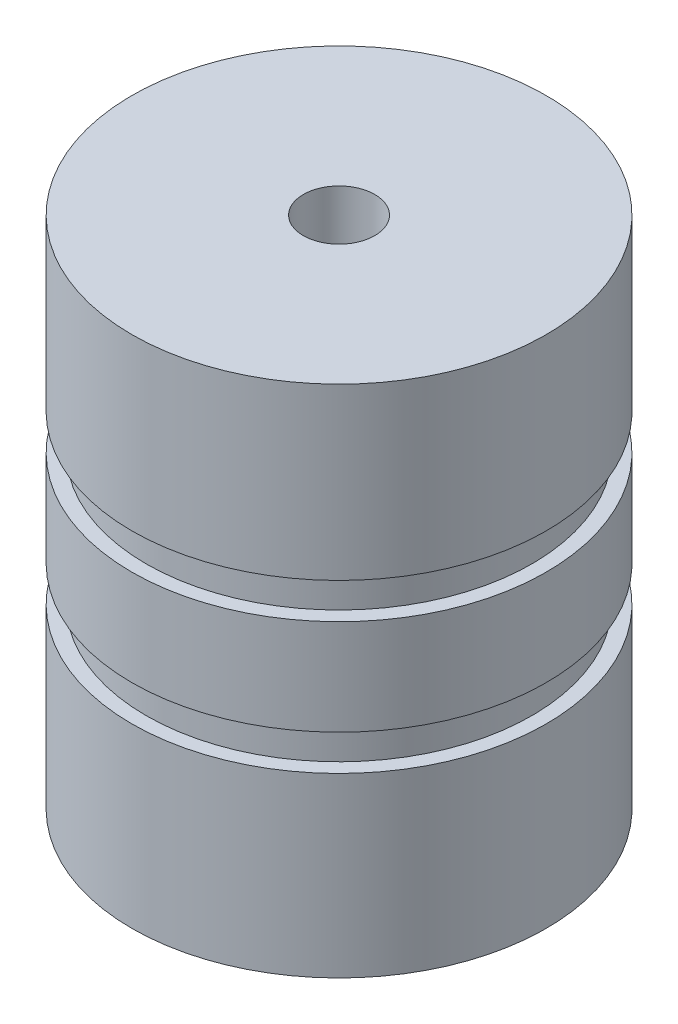
ISO-10303-21;
HEADER;
FILE_DESCRIPTION(('STEP AP214'),'2;1');
FILE_NAME('part.step','',(''),(''),'','','');
FILE_SCHEMA(('AUTOMOTIVE_DESIGN { 1 0 10303 214 1 1 1 1 }'));
ENDSEC;
DATA;
#1=APPLICATION_CONTEXT('core data for automotive mechanical design processes');
#2=APPLICATION_PROTOCOL_DEFINITION('international standard','automotive_design',2000,#1);
#3=PRODUCT_CONTEXT('',#1,'mechanical');
#4=PRODUCT('Part','Part','',(#3));
#5=PRODUCT_RELATED_PRODUCT_CATEGORY('part','',(#4));
#6=PRODUCT_DEFINITION_FORMATION('','',#4);
#7=PRODUCT_DEFINITION_CONTEXT('part definition',#1,'design');
#8=PRODUCT_DEFINITION('design','',#6,#7);
#9=PRODUCT_DEFINITION_SHAPE('','',#8);
#10=(LENGTH_UNIT() NAMED_UNIT(*) SI_UNIT(.MILLI.,.METRE.));
#11=(NAMED_UNIT(*) PLANE_ANGLE_UNIT() SI_UNIT($,.RADIAN.));
#12=(NAMED_UNIT(*) SI_UNIT($,.STERADIAN.) SOLID_ANGLE_UNIT());
#13=UNCERTAINTY_MEASURE_WITH_UNIT(LENGTH_MEASURE(1.E-05),#10,'distance_accuracy_value','');
#14=(GEOMETRIC_REPRESENTATION_CONTEXT(3) GLOBAL_UNCERTAINTY_ASSIGNED_CONTEXT((#13)) GLOBAL_UNIT_ASSIGNED_CONTEXT((#10,
#11,#12)) REPRESENTATION_CONTEXT('',''));
#15=CARTESIAN_POINT('',(0.,0.,0.));
#16=DIRECTION('',(0.,0.,1.));
#17=DIRECTION('',(1.,0.,0.));
#18=AXIS2_PLACEMENT_3D('',#15,#16,#17);
#19=CARTESIAN_POINT('',(0.,18.,0.));
#20=DIRECTION('',(0.,-1.,0.));
#21=DIRECTION('',(0.,0.,-1.));
#22=AXIS2_PLACEMENT_3D('',#19,#20,#21);
#23=CYLINDRICAL_SURFACE('',#22,14.5);
#24=CARTESIAN_POINT('',(0.,-18.,0.));
#25=DIRECTION('',(0.,1.,0.));
#26=DIRECTION('',(0.,0.,1.));
#27=AXIS2_PLACEMENT_3D('',#24,#25,#26);
#28=CIRCLE('',#27,14.5);
#29=CARTESIAN_POINT('',(0.,-18.,14.5));
#30=VERTEX_POINT('',#29);
#31=EDGE_CURVE('E52',#30,#30,#28,.T.);
#32=ORIENTED_EDGE('',*,*,#31,.T.);
#33=EDGE_LOOP('',(#32));
#34=FACE_BOUND('',#33,.T.);
#35=CARTESIAN_POINT('',(0.,-5.6,0.));
#36=DIRECTION('',(0.,1.,0.));
#37=DIRECTION('',(0.,0.,1.));
#38=AXIS2_PLACEMENT_3D('',#35,#36,#37);
#39=CIRCLE('',#38,14.5);
#40=CARTESIAN_POINT('',(0.,-5.60000000000001,14.5));
#41=VERTEX_POINT('',#40);
#42=EDGE_CURVE('E88',#41,#41,#39,.T.);
#43=ORIENTED_EDGE('',*,*,#42,.F.);
#44=EDGE_LOOP('',(#43));
#45=FACE_BOUND('',#44,.T.);
#46=ADVANCED_FACE('F43',(#34,#45),#23,.T.);
#47=CARTESIAN_POINT('',(0.,-18.,0.));
#48=DIRECTION('',(0.,1.,0.));
#49=DIRECTION('',(0.,0.,1.));
#50=AXIS2_PLACEMENT_3D('',#47,#48,#49);
#51=PLANE('',#50);
#52=CARTESIAN_POINT('',(0.,-18.,0.));
#53=DIRECTION('',(0.,1.,0.));
#54=DIRECTION('',(0.,0.,1.));
#55=AXIS2_PLACEMENT_3D('',#52,#53,#54);
#56=CIRCLE('',#55,4.);
#57=CARTESIAN_POINT('',(0.,-18.,4.));
#58=VERTEX_POINT('',#57);
#59=EDGE_CURVE('E81',#58,#58,#56,.F.);
#60=ORIENTED_EDGE('',*,*,#59,.F.);
#61=EDGE_LOOP('',(#60));
#62=FACE_BOUND('',#61,.T.);
#63=ORIENTED_EDGE('',*,*,#31,.F.);
#64=EDGE_LOOP('',(#63));
#65=FACE_BOUND('',#64,.T.);
#66=ADVANCED_FACE('F135',(#62,#65),#51,.F.);
#67=CARTESIAN_POINT('',(0.,-3.1,-14.5));
#68=DIRECTION('',(0.,-1.,0.));
#69=DIRECTION('',(0.,0.,-1.));
#70=AXIS2_PLACEMENT_3D('',#67,#68,#69);
#71=PLANE('',#70);
#72=CARTESIAN_POINT('',(0.,-3.1,0.));
#73=DIRECTION('',(0.,1.,0.));
#74=DIRECTION('',(0.,0.,1.));
#75=AXIS2_PLACEMENT_3D('',#72,#73,#74);
#76=CIRCLE('',#75,13.5);
#77=CARTESIAN_POINT('',(0.,-3.1,13.5));
#78=VERTEX_POINT('',#77);
#79=EDGE_CURVE('E96',#78,#78,#76,.T.);
#80=ORIENTED_EDGE('',*,*,#79,.T.);
#81=EDGE_LOOP('',(#80));
#82=FACE_BOUND('',#81,.T.);
#83=CARTESIAN_POINT('',(0.,-3.10000000000001,0.));
#84=DIRECTION('',(0.,1.,0.));
#85=DIRECTION('',(0.,0.,1.));
#86=AXIS2_PLACEMENT_3D('',#83,#84,#85);
#87=CIRCLE('',#86,14.5);
#88=CARTESIAN_POINT('',(0.,-3.10000000000001,14.5));
#89=VERTEX_POINT('',#88);
#90=EDGE_CURVE('E58',#89,#89,#87,.T.);
#91=ORIENTED_EDGE('',*,*,#90,.F.);
#92=EDGE_LOOP('',(#91));
#93=FACE_BOUND('',#92,.T.);
#94=ADVANCED_FACE('F141',(#82,#93),#71,.T.);
#95=CARTESIAN_POINT('',(0.,24.4564263685358,0.));
#96=DIRECTION('',(0.,1.,0.));
#97=DIRECTION('',(0.,0.,1.));
#98=AXIS2_PLACEMENT_3D('',#95,#96,#97);
#99=CYLINDRICAL_SURFACE('',#98,13.5);
#100=CARTESIAN_POINT('',(0.,-5.6,0.));
#101=DIRECTION('',(0.,1.,0.));
#102=DIRECTION('',(0.,0.,1.));
#103=AXIS2_PLACEMENT_3D('',#100,#101,#102);
#104=CIRCLE('',#103,13.5);
#105=CARTESIAN_POINT('',(0.,-5.6,13.5));
#106=VERTEX_POINT('',#105);
#107=EDGE_CURVE('E92',#106,#106,#104,.T.);
#108=ORIENTED_EDGE('',*,*,#107,.T.);
#109=EDGE_LOOP('',(#108));
#110=FACE_BOUND('',#109,.T.);
#111=ORIENTED_EDGE('',*,*,#79,.F.);
#112=EDGE_LOOP('',(#111));
#113=FACE_BOUND('',#112,.T.);
#114=ADVANCED_FACE('F166',(#110,#113),#99,.T.);
#115=CARTESIAN_POINT('',(0.,-5.6,-13.5));
#116=DIRECTION('',(0.,1.,0.));
#117=DIRECTION('',(0.,0.,1.));
#118=AXIS2_PLACEMENT_3D('',#115,#116,#117);
#119=PLANE('',#118);
#120=ORIENTED_EDGE('',*,*,#42,.T.);
#121=EDGE_LOOP('',(#120));
#122=FACE_BOUND('',#121,.T.);
#123=ORIENTED_EDGE('',*,*,#107,.F.);
#124=EDGE_LOOP('',(#123));
#125=FACE_BOUND('',#124,.T.);
#126=ADVANCED_FACE('F131',(#122,#125),#119,.T.);
#127=CARTESIAN_POINT('',(0.,3.6,0.));
#128=DIRECTION('',(0.,1.,0.));
#129=DIRECTION('',(0.,0.,1.));
#130=AXIS2_PLACEMENT_3D('',#127,#128,#129);
#131=CIRCLE('',#130,14.5);
#132=CARTESIAN_POINT('',(0.,3.59999999999999,14.5));
#133=VERTEX_POINT('',#132);
#134=EDGE_CURVE('E86',#133,#133,#131,.T.);
#135=ORIENTED_EDGE('',*,*,#134,.F.);
#136=EDGE_LOOP('',(#135));
#137=FACE_BOUND('',#136,.T.);
#138=ORIENTED_EDGE('',*,*,#90,.T.);
#139=EDGE_LOOP('',(#138));
#140=FACE_BOUND('',#139,.T.);
#141=ADVANCED_FACE('F45',(#137,#140),#23,.T.);
#142=CARTESIAN_POINT('',(0.,6.1,-14.5));
#143=DIRECTION('',(0.,-1.,0.));
#144=DIRECTION('',(0.,0.,-1.));
#145=AXIS2_PLACEMENT_3D('',#142,#143,#144);
#146=PLANE('',#145);
#147=CARTESIAN_POINT('',(0.,6.1,0.));
#148=DIRECTION('',(0.,1.,0.));
#149=DIRECTION('',(0.,0.,1.));
#150=AXIS2_PLACEMENT_3D('',#147,#148,#149);
#151=CIRCLE('',#150,13.5);
#152=CARTESIAN_POINT('',(0.,6.1,13.5));
#153=VERTEX_POINT('',#152);
#154=EDGE_CURVE('E109',#153,#153,#151,.T.);
#155=ORIENTED_EDGE('',*,*,#154,.T.);
#156=EDGE_LOOP('',(#155));
#157=FACE_BOUND('',#156,.T.);
#158=CARTESIAN_POINT('',(0.,6.09999999999999,0.));
#159=DIRECTION('',(0.,1.,0.));
#160=DIRECTION('',(0.,0.,1.));
#161=AXIS2_PLACEMENT_3D('',#158,#159,#160);
#162=CIRCLE('',#161,14.5);
#163=CARTESIAN_POINT('',(0.,6.09999999999999,14.5));
#164=VERTEX_POINT('',#163);
#165=EDGE_CURVE('E61',#164,#164,#162,.T.);
#166=ORIENTED_EDGE('',*,*,#165,.F.);
#167=EDGE_LOOP('',(#166));
#168=FACE_BOUND('',#167,.T.);
#169=ADVANCED_FACE('F120',(#157,#168),#146,.T.);
#170=CARTESIAN_POINT('',(0.,24.4564263685358,0.));
#171=DIRECTION('',(0.,1.,0.));
#172=DIRECTION('',(0.,0.,1.));
#173=AXIS2_PLACEMENT_3D('',#170,#171,#172);
#174=CYLINDRICAL_SURFACE('',#173,13.5);
#175=CARTESIAN_POINT('',(0.,3.6,0.));
#176=DIRECTION('',(0.,1.,0.));
#177=DIRECTION('',(0.,0.,1.));
#178=AXIS2_PLACEMENT_3D('',#175,#176,#177);
#179=CIRCLE('',#178,13.5);
#180=CARTESIAN_POINT('',(0.,3.6,13.5));
#181=VERTEX_POINT('',#180);
#182=EDGE_CURVE('E106',#181,#181,#179,.T.);
#183=ORIENTED_EDGE('',*,*,#182,.T.);
#184=EDGE_LOOP('',(#183));
#185=FACE_BOUND('',#184,.T.);
#186=ORIENTED_EDGE('',*,*,#154,.F.);
#187=EDGE_LOOP('',(#186));
#188=FACE_BOUND('',#187,.T.);
#189=ADVANCED_FACE('F122',(#185,#188),#174,.T.);
#190=CARTESIAN_POINT('',(0.,3.6,-13.5));
#191=DIRECTION('',(0.,1.,0.));
#192=DIRECTION('',(0.,0.,1.));
#193=AXIS2_PLACEMENT_3D('',#190,#191,#192);
#194=PLANE('',#193);
#195=ORIENTED_EDGE('',*,*,#134,.T.);
#196=EDGE_LOOP('',(#195));
#197=FACE_BOUND('',#196,.T.);
#198=ORIENTED_EDGE('',*,*,#182,.F.);
#199=EDGE_LOOP('',(#198));
#200=FACE_BOUND('',#199,.T.);
#201=ADVANCED_FACE('F128',(#197,#200),#194,.T.);
#202=CARTESIAN_POINT('',(0.,18.,0.));
#203=DIRECTION('',(0.,1.,0.));
#204=DIRECTION('',(0.,0.,1.));
#205=AXIS2_PLACEMENT_3D('',#202,#203,#204);
#206=PLANE('',#205);
#207=CARTESIAN_POINT('',(0.,18.,0.));
#208=DIRECTION('',(0.,1.,0.));
#209=DIRECTION('',(0.,0.,1.));
#210=AXIS2_PLACEMENT_3D('',#207,#208,#209);
#211=CIRCLE('',#210,2.5);
#212=CARTESIAN_POINT('',(0.,18.,-2.5));
#213=VERTEX_POINT('',#212);
#214=EDGE_CURVE('E67',#213,#213,#211,.T.);
#215=ORIENTED_EDGE('',*,*,#214,.F.);
#216=EDGE_LOOP('',(#215));
#217=FACE_BOUND('',#216,.T.);
#218=CARTESIAN_POINT('',(0.,18.,0.));
#219=DIRECTION('',(0.,1.,0.));
#220=DIRECTION('',(0.,0.,1.));
#221=AXIS2_PLACEMENT_3D('',#218,#219,#220);
#222=CIRCLE('',#221,14.5);
#223=CARTESIAN_POINT('',(0.,18.,14.5));
#224=VERTEX_POINT('',#223);
#225=EDGE_CURVE('E10',#224,#224,#222,.T.);
#226=ORIENTED_EDGE('',*,*,#225,.T.);
#227=EDGE_LOOP('',(#226));
#228=FACE_BOUND('',#227,.T.);
#229=ADVANCED_FACE('F146',(#217,#228),#206,.T.);
#230=ORIENTED_EDGE('',*,*,#225,.F.);
#231=EDGE_LOOP('',(#230));
#232=FACE_BOUND('',#231,.T.);
#233=ORIENTED_EDGE('',*,*,#165,.T.);
#234=EDGE_LOOP('',(#233));
#235=FACE_BOUND('',#234,.T.);
#236=ADVANCED_FACE('F118',(#232,#235),#23,.T.);
#237=CARTESIAN_POINT('',(0.,25.0710678118655,0.));
#238=DIRECTION('',(0.,-1.,0.));
#239=DIRECTION('',(0.,0.,-1.));
#240=AXIS2_PLACEMENT_3D('',#237,#238,#239);
#241=CYLINDRICAL_SURFACE('',#240,2.5);
#242=CARTESIAN_POINT('',(0.,5.85,0.));
#243=DIRECTION('',(0.,1.,0.));
#244=DIRECTION('',(0.,0.,1.));
#245=AXIS2_PLACEMENT_3D('',#242,#243,#244);
#246=CIRCLE('',#245,2.5);
#247=CARTESIAN_POINT('',(0.,5.84999999999999,-2.5));
#248=VERTEX_POINT('',#247);
#249=EDGE_CURVE('E63',#248,#248,#246,.F.);
#250=CARTESIAN_POINT('',(0.,18.,-2.5));
#251=CARTESIAN_POINT('',(0.,17.8734375,-2.5));
#252=CARTESIAN_POINT('',(0.,17.746875,-2.5));
#253=CARTESIAN_POINT('',(0.,17.49375,-2.5));
#254=CARTESIAN_POINT('',(0.,17.3671875,-2.5));
#255=CARTESIAN_POINT('',(0.,17.1140625,-2.5));
#256=CARTESIAN_POINT('',(0.,16.9875,-2.5));
#257=CARTESIAN_POINT('',(0.,16.734375,-2.5));
#258=CARTESIAN_POINT('',(0.,16.6078125,-2.5));
#259=CARTESIAN_POINT('',(0.,16.3546875,-2.5));
#260=CARTESIAN_POINT('',(0.,16.228125,-2.5));
#261=CARTESIAN_POINT('',(0.,15.975,-2.5));
#262=CARTESIAN_POINT('',(0.,15.8484375,-2.5));
#263=CARTESIAN_POINT('',(0.,15.5953125,-2.5));
#264=CARTESIAN_POINT('',(0.,15.46875,-2.5));
#265=CARTESIAN_POINT('',(0.,15.215625,-2.5));
#266=CARTESIAN_POINT('',(0.,15.0890625,-2.5));
#267=CARTESIAN_POINT('',(0.,14.8359375,-2.5));
#268=CARTESIAN_POINT('',(0.,14.709375,-2.5));
#269=CARTESIAN_POINT('',(0.,14.45625,-2.5));
#270=CARTESIAN_POINT('',(0.,14.3296875,-2.5));
#271=CARTESIAN_POINT('',(0.,14.0765625,-2.5));
#272=CARTESIAN_POINT('',(0.,13.95,-2.5));
#273=CARTESIAN_POINT('',(0.,13.696875,-2.5));
#274=CARTESIAN_POINT('',(0.,13.5703125,-2.5));
#275=CARTESIAN_POINT('',(0.,13.3171875,-2.5));
#276=CARTESIAN_POINT('',(0.,13.190625,-2.5));
#277=CARTESIAN_POINT('',(0.,12.9375,-2.5));
#278=CARTESIAN_POINT('',(0.,12.8109375,-2.5));
#279=CARTESIAN_POINT('',(0.,12.5578125,-2.5));
#280=CARTESIAN_POINT('',(0.,12.43125,-2.5));
#281=CARTESIAN_POINT('',(0.,12.178125,-2.5));
#282=CARTESIAN_POINT('',(0.,12.0515625,-2.5));
#283=CARTESIAN_POINT('',(0.,11.7984375,-2.5));
#284=CARTESIAN_POINT('',(0.,11.671875,-2.5));
#285=CARTESIAN_POINT('',(0.,11.41875,-2.5));
#286=CARTESIAN_POINT('',(0.,11.2921875,-2.5));
#287=CARTESIAN_POINT('',(0.,11.0390625,-2.5));
#288=CARTESIAN_POINT('',(0.,10.9125,-2.5));
#289=CARTESIAN_POINT('',(0.,10.659375,-2.5));
#290=CARTESIAN_POINT('',(0.,10.5328125,-2.5));
#291=CARTESIAN_POINT('',(0.,10.2796875,-2.5));
#292=CARTESIAN_POINT('',(0.,10.153125,-2.5));
#293=CARTESIAN_POINT('',(0.,9.89999999999999,-2.5));
#294=CARTESIAN_POINT('',(0.,9.77343749999999,-2.5));
#295=CARTESIAN_POINT('',(0.,9.52031249999999,-2.5));
#296=CARTESIAN_POINT('',(0.,9.39375,-2.5));
#297=CARTESIAN_POINT('',(0.,9.140625,-2.5));
#298=CARTESIAN_POINT('',(0.,9.0140625,-2.5));
#299=CARTESIAN_POINT('',(0.,8.7609375,-2.5));
#300=CARTESIAN_POINT('',(0.,8.634375,-2.5));
#301=CARTESIAN_POINT('',(0.,8.38124999999999,-2.5));
#302=CARTESIAN_POINT('',(0.,8.25468749999999,-2.5));
#303=CARTESIAN_POINT('',(0.,8.0015625,-2.5));
#304=CARTESIAN_POINT('',(0.,7.87499999999999,-2.5));
#305=CARTESIAN_POINT('',(0.,7.621875,-2.5));
#306=CARTESIAN_POINT('',(0.,7.49531249999999,-2.5));
#307=CARTESIAN_POINT('',(0.,7.24218749999999,-2.5));
#308=CARTESIAN_POINT('',(0.,7.115625,-2.5));
#309=CARTESIAN_POINT('',(0.,6.8625,-2.5));
#310=CARTESIAN_POINT('',(0.,6.73593749999999,-2.5));
#311=CARTESIAN_POINT('',(0.,6.48281249999999,-2.5));
#312=CARTESIAN_POINT('',(0.,6.35624999999999,-2.5));
#313=CARTESIAN_POINT('',(0.,6.10312499999999,-2.5));
#314=CARTESIAN_POINT('',(0.,5.97656249999999,-2.5));
#315=CARTESIAN_POINT('',(0.,5.84999999999999,-2.5));
#316=B_SPLINE_CURVE_WITH_KNOTS('',3,(#250,#251,#252,#253,#254,#255,#256,#257,#258,#259,#260,
#261,#262,#263,#264,#265,#266,#267,#268,#269,#270,#271,#272,#273,#274,#275,#276,#277,#278,#279,
#280,#281,#282,#283,#284,#285,#286,#287,#288,#289,#290,#291,#292,#293,#294,#295,#296,#297,#298,
#299,#300,#301,#302,#303,#304,#305,#306,#307,#308,#309,#310,#311,#312,#313,#314,#315),
.UNSPECIFIED.,.F.,.F.,(4,2,2,2,2,2,2,2,2,2,2,2,2,2,2,2,2,2,2,2,2,2,2,2,2,2,2,2,2,2,2,2,4),(0.,
0.3796875,0.759375,1.1390625,1.51875,1.8984375,2.278125,2.6578125,3.0375,3.4171875,3.796875,
4.1765625,4.55625,4.9359375,5.315625,5.6953125,6.075,6.4546875,6.834375,7.2140625,
7.59375000000001,7.9734375,8.353125,8.7328125,9.1125,9.4921875,9.87187500000001,10.2515625,
10.63125,11.0109375,11.390625,11.7703125,12.15),.UNSPECIFIED.);
#317=EDGE_CURVE('BSEAM145',#213,#248,#316,.T.);
#318=ORIENTED_EDGE('',*,*,#214,.T.);
#319=ORIENTED_EDGE('',*,*,#249,.T.);
#320=ORIENTED_EDGE('',*,*,#317,.T.);
#321=ORIENTED_EDGE('',*,*,#317,.F.);
#322=EDGE_LOOP('',(#318,#320,#319,#321));
#323=FACE_BOUND('',#322,.T.);
#324=ADVANCED_FACE('F145',(#323),#241,.F.);
#325=CARTESIAN_POINT('',(0.,-5.85,0.));
#326=DIRECTION('',(0.,1.,0.));
#327=DIRECTION('',(0.,0.,1.));
#328=AXIS2_PLACEMENT_3D('',#325,#326,#327);
#329=CYLINDRICAL_SURFACE('',#328,7.5);
#330=CARTESIAN_POINT('',(0.,-5.85,0.));
#331=DIRECTION('',(0.,1.,0.));
#332=DIRECTION('',(0.,0.,1.));
#333=AXIS2_PLACEMENT_3D('',#330,#331,#332);
#334=CIRCLE('',#333,7.5);
#335=CARTESIAN_POINT('',(0.,-5.85,7.5));
#336=VERTEX_POINT('',#335);
#337=EDGE_CURVE('E73',#336,#336,#334,.T.);
#338=ORIENTED_EDGE('',*,*,#337,.F.);
#339=EDGE_LOOP('',(#338));
#340=FACE_BOUND('',#339,.T.);
#341=CARTESIAN_POINT('',(0.,5.85,0.));
#342=DIRECTION('',(0.,1.,0.));
#343=DIRECTION('',(0.,0.,1.));
#344=AXIS2_PLACEMENT_3D('',#341,#342,#343);
#345=CIRCLE('',#344,7.5);
#346=CARTESIAN_POINT('',(0.,5.85,7.5));
#347=VERTEX_POINT('',#346);
#348=EDGE_CURVE('E66',#347,#347,#345,.T.);
#349=ORIENTED_EDGE('',*,*,#348,.T.);
#350=EDGE_LOOP('',(#349));
#351=FACE_BOUND('',#350,.T.);
#352=ADVANCED_FACE('F153',(#340,#351),#329,.F.);
#353=CARTESIAN_POINT('',(0.,-5.85,0.));
#354=DIRECTION('',(0.,1.,0.));
#355=DIRECTION('',(0.,0.,1.));
#356=AXIS2_PLACEMENT_3D('',#353,#354,#355);
#357=PLANE('',#356);
#358=CARTESIAN_POINT('',(0.,-5.85,0.));
#359=DIRECTION('',(0.,1.,0.));
#360=DIRECTION('',(0.,0.,1.));
#361=AXIS2_PLACEMENT_3D('',#358,#359,#360);
#362=CIRCLE('',#361,4.);
#363=CARTESIAN_POINT('',(0.,-5.85,4.));
#364=VERTEX_POINT('',#363);
#365=EDGE_CURVE('E47',#364,#364,#362,.T.);
#366=ORIENTED_EDGE('',*,*,#365,.F.);
#367=EDGE_LOOP('',(#366));
#368=FACE_BOUND('',#367,.T.);
#369=ORIENTED_EDGE('',*,*,#337,.T.);
#370=EDGE_LOOP('',(#369));
#371=FACE_BOUND('',#370,.T.);
#372=ADVANCED_FACE('F175',(#368,#371),#357,.T.);
#373=CARTESIAN_POINT('',(0.,5.85,0.));
#374=DIRECTION('',(0.,1.,0.));
#375=DIRECTION('',(0.,0.,1.));
#376=AXIS2_PLACEMENT_3D('',#373,#374,#375);
#377=PLANE('',#376);
#378=ORIENTED_EDGE('',*,*,#249,.F.);
#379=EDGE_LOOP('',(#378));
#380=FACE_BOUND('',#379,.T.);
#381=ORIENTED_EDGE('',*,*,#348,.F.);
#382=EDGE_LOOP('',(#381));
#383=FACE_BOUND('',#382,.T.);
#384=ADVANCED_FACE('F177',(#380,#383),#377,.F.);
#385=CARTESIAN_POINT('',(0.,-29.3137084989848,0.));
#386=DIRECTION('',(0.,1.,0.));
#387=DIRECTION('',(0.,0.,1.));
#388=AXIS2_PLACEMENT_3D('',#385,#386,#387);
#389=CYLINDRICAL_SURFACE('',#388,4.);
#390=ORIENTED_EDGE('',*,*,#365,.T.);
#391=EDGE_LOOP('',(#390));
#392=FACE_BOUND('',#391,.T.);
#393=ORIENTED_EDGE('',*,*,#59,.T.);
#394=EDGE_LOOP('',(#393));
#395=FACE_BOUND('',#394,.T.);
#396=ADVANCED_FACE('F180',(#392,#395),#389,.F.);
#397=CLOSED_SHELL('',(#46,#66,#94,#114,#126,#141,#169,#189,#201,#229,#236,#324,#352,#372,#384,#396));
#398=MANIFOLD_SOLID_BREP('B2',#397);
#399=ADVANCED_BREP_SHAPE_REPRESENTATION('',(#18,#398),#14);
#400=SHAPE_DEFINITION_REPRESENTATION(#9,#399);
ENDSEC;
END-ISO-10303-21;
